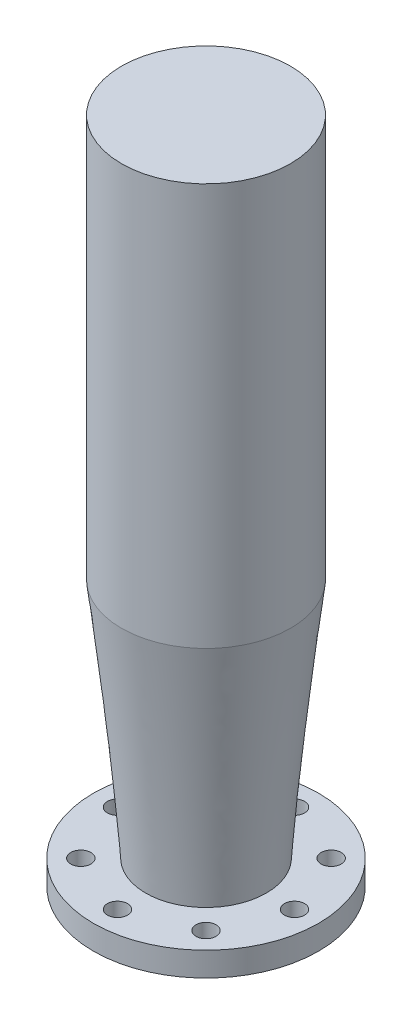
ISO-10303-21;
HEADER;
FILE_DESCRIPTION(('STEP AP214'),'2;1');
FILE_NAME('part.step','',(''),(''),'','','');
FILE_SCHEMA(('AUTOMOTIVE_DESIGN { 1 0 10303 214 1 1 1 1 }'));
ENDSEC;
DATA;
#1=APPLICATION_CONTEXT('core data for automotive mechanical design processes');
#2=APPLICATION_PROTOCOL_DEFINITION('international standard','automotive_design',2000,#1);
#3=PRODUCT_CONTEXT('',#1,'mechanical');
#4=PRODUCT('Part','Part','',(#3));
#5=PRODUCT_RELATED_PRODUCT_CATEGORY('part','',(#4));
#6=PRODUCT_DEFINITION_FORMATION('','',#4);
#7=PRODUCT_DEFINITION_CONTEXT('part definition',#1,'design');
#8=PRODUCT_DEFINITION('design','',#6,#7);
#9=PRODUCT_DEFINITION_SHAPE('','',#8);
#10=(LENGTH_UNIT() NAMED_UNIT(*) SI_UNIT(.MILLI.,.METRE.));
#11=(NAMED_UNIT(*) PLANE_ANGLE_UNIT() SI_UNIT($,.RADIAN.));
#12=(NAMED_UNIT(*) SI_UNIT($,.STERADIAN.) SOLID_ANGLE_UNIT());
#13=UNCERTAINTY_MEASURE_WITH_UNIT(LENGTH_MEASURE(1.E-05),#10,'distance_accuracy_value','');
#14=(GEOMETRIC_REPRESENTATION_CONTEXT(3) GLOBAL_UNCERTAINTY_ASSIGNED_CONTEXT((#13)) GLOBAL_UNIT_ASSIGNED_CONTEXT((#10,
#11,#12)) REPRESENTATION_CONTEXT('',''));
#15=CARTESIAN_POINT('',(0.,0.,0.));
#16=DIRECTION('',(0.,0.,1.));
#17=DIRECTION('',(1.,0.,0.));
#18=AXIS2_PLACEMENT_3D('',#15,#16,#17);
#19=CARTESIAN_POINT('',(0.,3.,0.));
#20=DIRECTION('',(0.,1.,0.));
#21=DIRECTION('',(0.,0.,1.));
#22=AXIS2_PLACEMENT_3D('',#19,#20,#21);
#23=PLANE('',#22);
#24=CARTESIAN_POINT('',(-7.77817459305222,3.,-7.77817459305155));
#25=DIRECTION('',(0.,1.,0.));
#26=DIRECTION('',(0.,0.,1.));
#27=AXIS2_PLACEMENT_3D('',#24,#25,#26);
#28=CIRCLE('',#27,1.25000000000064);
#29=CARTESIAN_POINT('',(-7.77817459305222,3.,-6.52817459305091));
#30=VERTEX_POINT('',#29);
#31=EDGE_CURVE('E103',#30,#30,#28,.T.);
#32=ORIENTED_EDGE('',*,*,#31,.F.);
#33=EDGE_LOOP('',(#32));
#34=FACE_BOUND('',#33,.T.);
#35=CARTESIAN_POINT('',(-7.77817459305155,3.,7.77817459305316));
#36=DIRECTION('',(0.,1.,0.));
#37=DIRECTION('',(0.,0.,1.));
#38=AXIS2_PLACEMENT_3D('',#35,#36,#37);
#39=CIRCLE('',#38,1.25000000000104);
#40=CARTESIAN_POINT('',(-7.77817459305155,3.,9.0281745930542));
#41=VERTEX_POINT('',#40);
#42=EDGE_CURVE('E116',#41,#41,#39,.T.);
#43=ORIENTED_EDGE('',*,*,#42,.F.);
#44=EDGE_LOOP('',(#43));
#45=FACE_BOUND('',#44,.T.);
#46=CARTESIAN_POINT('',(7.77817459305316,3.,7.77817459305249));
#47=DIRECTION('',(0.,1.,0.));
#48=DIRECTION('',(0.,0.,1.));
#49=AXIS2_PLACEMENT_3D('',#46,#47,#48);
#50=CIRCLE('',#49,1.25000000000017);
#51=CARTESIAN_POINT('',(7.77817459305316,3.,9.02817459305266));
#52=VERTEX_POINT('',#51);
#53=EDGE_CURVE('E128',#52,#52,#50,.T.);
#54=ORIENTED_EDGE('',*,*,#53,.F.);
#55=EDGE_LOOP('',(#54));
#56=FACE_BOUND('',#55,.T.);
#57=CARTESIAN_POINT('',(7.77817459305249,3.,-7.77817459305222));
#58=DIRECTION('',(0.,1.,0.));
#59=DIRECTION('',(0.,0.,1.));
#60=AXIS2_PLACEMENT_3D('',#57,#58,#59);
#61=CIRCLE('',#60,1.2499999999997);
#62=CARTESIAN_POINT('',(7.77817459305249,3.,-6.52817459305252));
#63=VERTEX_POINT('',#62);
#64=EDGE_CURVE('E140',#63,#63,#61,.T.);
#65=ORIENTED_EDGE('',*,*,#64,.F.);
#66=EDGE_LOOP('',(#65));
#67=FACE_BOUND('',#66,.T.);
#68=CARTESIAN_POINT('',(0.,3.,0.));
#69=DIRECTION('',(0.,1.,0.));
#70=DIRECTION('',(0.,0.,1.));
#71=AXIS2_PLACEMENT_3D('',#68,#69,#70);
#72=CIRCLE('',#71,14.);
#73=CARTESIAN_POINT('',(0.,3.,14.));
#74=VERTEX_POINT('',#73);
#75=EDGE_CURVE('E11',#74,#74,#72,.T.);
#76=ORIENTED_EDGE('',*,*,#75,.T.);
#77=EDGE_LOOP('',(#76));
#78=FACE_BOUND('',#77,.T.);
#79=CARTESIAN_POINT('',(0.,3.,-11.));
#80=DIRECTION('',(0.,1.,0.));
#81=DIRECTION('',(0.,0.,1.));
#82=AXIS2_PLACEMENT_3D('',#79,#80,#81);
#83=CIRCLE('',#82,1.25);
#84=CARTESIAN_POINT('',(0.,3.,-9.75));
#85=VERTEX_POINT('',#84);
#86=EDGE_CURVE('E49',#85,#85,#83,.T.);
#87=ORIENTED_EDGE('',*,*,#86,.F.);
#88=EDGE_LOOP('',(#87));
#89=FACE_BOUND('',#88,.T.);
#90=CARTESIAN_POINT('',(11.0000000000009,3.,0.));
#91=DIRECTION('',(0.,1.,0.));
#92=DIRECTION('',(0.,0.,1.));
#93=AXIS2_PLACEMENT_3D('',#90,#91,#92);
#94=CIRCLE('',#93,1.24999999999976);
#95=CARTESIAN_POINT('',(11.0000000000009,3.,1.24999999999976));
#96=VERTEX_POINT('',#95);
#97=EDGE_CURVE('E134',#96,#96,#94,.T.);
#98=ORIENTED_EDGE('',*,*,#97,.F.);
#99=EDGE_LOOP('',(#98));
#100=FACE_BOUND('',#99,.T.);
#101=CARTESIAN_POINT('',(9.40484768009522E-13,3.,11.0000000000009));
#102=DIRECTION('',(0.,1.,0.));
#103=DIRECTION('',(0.,0.,1.));
#104=AXIS2_PLACEMENT_3D('',#101,#102,#103);
#105=CIRCLE('',#104,1.2500000000007);
#106=CARTESIAN_POINT('',(9.40484768009522E-13,3.,12.2500000000016));
#107=VERTEX_POINT('',#106);
#108=EDGE_CURVE('E122',#107,#107,#105,.T.);
#109=ORIENTED_EDGE('',*,*,#108,.F.);
#110=EDGE_LOOP('',(#109));
#111=FACE_BOUND('',#110,.T.);
#112=CARTESIAN_POINT('',(-11.,3.,9.39964833997561E-13));
#113=DIRECTION('',(0.,1.,0.));
#114=DIRECTION('',(0.,0.,1.));
#115=AXIS2_PLACEMENT_3D('',#112,#113,#114);
#116=CIRCLE('',#115,1.25000000000101);
#117=CARTESIAN_POINT('',(-11.,3.,1.25000000000195));
#118=VERTEX_POINT('',#117);
#119=EDGE_CURVE('E110',#118,#118,#116,.T.);
#120=ORIENTED_EDGE('',*,*,#119,.F.);
#121=EDGE_LOOP('',(#120));
#122=FACE_BOUND('',#121,.T.);
#123=CARTESIAN_POINT('',(0.,3.,0.));
#124=DIRECTION('',(0.,1.,0.));
#125=DIRECTION('',(0.,0.,1.));
#126=AXIS2_PLACEMENT_3D('',#123,#124,#125);
#127=CIRCLE('',#126,7.5);
#128=CARTESIAN_POINT('',(-7.15586237167852,3.,2.24580357947785));
#129=VERTEX_POINT('',#128);
#130=EDGE_CURVE('E93',#129,#129,#127,.T.);
#131=ORIENTED_EDGE('',*,*,#130,.F.);
#132=EDGE_LOOP('',(#131));
#133=FACE_BOUND('',#132,.T.);
#134=ADVANCED_FACE('F35',(#34,#45,#56,#67,#78,#89,#100,#111,#122,#133),#23,.T.);
#135=CARTESIAN_POINT('',(0.,0.,0.));
#136=DIRECTION('',(0.,1.,0.));
#137=DIRECTION('',(0.,0.,1.));
#138=AXIS2_PLACEMENT_3D('',#135,#136,#137);
#139=PLANE('',#138);
#140=CARTESIAN_POINT('',(0.,0.,0.));
#141=DIRECTION('',(0.,1.,0.));
#142=DIRECTION('',(0.,0.,1.));
#143=AXIS2_PLACEMENT_3D('',#140,#141,#142);
#144=CIRCLE('',#143,14.);
#145=CARTESIAN_POINT('',(0.,0.,14.));
#146=VERTEX_POINT('',#145);
#147=EDGE_CURVE('E44',#146,#146,#144,.T.);
#148=ORIENTED_EDGE('',*,*,#147,.F.);
#149=EDGE_LOOP('',(#148));
#150=FACE_BOUND('',#149,.T.);
#151=CARTESIAN_POINT('',(0.,0.,-11.));
#152=DIRECTION('',(0.,1.,0.));
#153=DIRECTION('',(0.,0.,1.));
#154=AXIS2_PLACEMENT_3D('',#151,#152,#153);
#155=CIRCLE('',#154,1.25);
#156=CARTESIAN_POINT('',(0.,0.,-9.75));
#157=VERTEX_POINT('',#156);
#158=EDGE_CURVE('E52',#157,#157,#155,.T.);
#159=ORIENTED_EDGE('',*,*,#158,.T.);
#160=EDGE_LOOP('',(#159));
#161=FACE_BOUND('',#160,.T.);
#162=CARTESIAN_POINT('',(7.77817459305249,0.,-7.77817459305222));
#163=DIRECTION('',(0.,1.,0.));
#164=DIRECTION('',(0.,0.,1.));
#165=AXIS2_PLACEMENT_3D('',#162,#163,#164);
#166=CIRCLE('',#165,1.2499999999997);
#167=CARTESIAN_POINT('',(7.77817459305249,0.,-6.52817459305252));
#168=VERTEX_POINT('',#167);
#169=EDGE_CURVE('E137',#168,#168,#166,.T.);
#170=ORIENTED_EDGE('',*,*,#169,.T.);
#171=EDGE_LOOP('',(#170));
#172=FACE_BOUND('',#171,.T.);
#173=CARTESIAN_POINT('',(11.0000000000009,0.,0.));
#174=DIRECTION('',(0.,1.,0.));
#175=DIRECTION('',(0.,0.,1.));
#176=AXIS2_PLACEMENT_3D('',#173,#174,#175);
#177=CIRCLE('',#176,1.24999999999976);
#178=CARTESIAN_POINT('',(11.0000000000009,0.,1.24999999999976));
#179=VERTEX_POINT('',#178);
#180=EDGE_CURVE('E131',#179,#179,#177,.T.);
#181=ORIENTED_EDGE('',*,*,#180,.T.);
#182=EDGE_LOOP('',(#181));
#183=FACE_BOUND('',#182,.T.);
#184=CARTESIAN_POINT('',(7.77817459305316,0.,7.77817459305249));
#185=DIRECTION('',(0.,1.,0.));
#186=DIRECTION('',(0.,0.,1.));
#187=AXIS2_PLACEMENT_3D('',#184,#185,#186);
#188=CIRCLE('',#187,1.25000000000017);
#189=CARTESIAN_POINT('',(7.77817459305316,0.,9.02817459305266));
#190=VERTEX_POINT('',#189);
#191=EDGE_CURVE('E125',#190,#190,#188,.T.);
#192=ORIENTED_EDGE('',*,*,#191,.T.);
#193=EDGE_LOOP('',(#192));
#194=FACE_BOUND('',#193,.T.);
#195=CARTESIAN_POINT('',(9.40484768009522E-13,0.,11.0000000000009));
#196=DIRECTION('',(0.,1.,0.));
#197=DIRECTION('',(0.,0.,1.));
#198=AXIS2_PLACEMENT_3D('',#195,#196,#197);
#199=CIRCLE('',#198,1.2500000000007);
#200=CARTESIAN_POINT('',(9.40484768009522E-13,0.,12.2500000000016));
#201=VERTEX_POINT('',#200);
#202=EDGE_CURVE('E119',#201,#201,#199,.T.);
#203=ORIENTED_EDGE('',*,*,#202,.T.);
#204=EDGE_LOOP('',(#203));
#205=FACE_BOUND('',#204,.T.);
#206=CARTESIAN_POINT('',(-7.77817459305155,0.,7.77817459305316));
#207=DIRECTION('',(0.,1.,0.));
#208=DIRECTION('',(0.,0.,1.));
#209=AXIS2_PLACEMENT_3D('',#206,#207,#208);
#210=CIRCLE('',#209,1.25000000000104);
#211=CARTESIAN_POINT('',(-7.77817459305155,0.,9.0281745930542));
#212=VERTEX_POINT('',#211);
#213=EDGE_CURVE('E113',#212,#212,#210,.T.);
#214=ORIENTED_EDGE('',*,*,#213,.T.);
#215=EDGE_LOOP('',(#214));
#216=FACE_BOUND('',#215,.T.);
#217=CARTESIAN_POINT('',(-11.,0.,9.39964833997561E-13));
#218=DIRECTION('',(0.,1.,0.));
#219=DIRECTION('',(0.,0.,1.));
#220=AXIS2_PLACEMENT_3D('',#217,#218,#219);
#221=CIRCLE('',#220,1.25000000000101);
#222=CARTESIAN_POINT('',(-11.,0.,1.25000000000195));
#223=VERTEX_POINT('',#222);
#224=EDGE_CURVE('E106',#223,#223,#221,.T.);
#225=ORIENTED_EDGE('',*,*,#224,.T.);
#226=EDGE_LOOP('',(#225));
#227=FACE_BOUND('',#226,.T.);
#228=CARTESIAN_POINT('',(-7.77817459305222,0.,-7.77817459305155));
#229=DIRECTION('',(0.,1.,0.));
#230=DIRECTION('',(0.,0.,1.));
#231=AXIS2_PLACEMENT_3D('',#228,#229,#230);
#232=CIRCLE('',#231,1.25000000000064);
#233=CARTESIAN_POINT('',(-7.77817459305222,0.,-6.52817459305091));
#234=VERTEX_POINT('',#233);
#235=EDGE_CURVE('E107',#234,#234,#232,.T.);
#236=ORIENTED_EDGE('',*,*,#235,.T.);
#237=EDGE_LOOP('',(#236));
#238=FACE_BOUND('',#237,.T.);
#239=ADVANCED_FACE('F150',(#150,#161,#172,#183,#194,#205,#216,#227,#238),#139,.F.);
#240=CARTESIAN_POINT('',(0.,3.,0.));
#241=DIRECTION('',(0.,-1.,0.));
#242=DIRECTION('',(0.,0.,-1.));
#243=AXIS2_PLACEMENT_3D('',#240,#241,#242);
#244=CYLINDRICAL_SURFACE('',#243,14.);
#245=ORIENTED_EDGE('',*,*,#75,.F.);
#246=EDGE_LOOP('',(#245));
#247=FACE_BOUND('',#246,.T.);
#248=ORIENTED_EDGE('',*,*,#147,.T.);
#249=EDGE_LOOP('',(#248));
#250=FACE_BOUND('',#249,.T.);
#251=ADVANCED_FACE('F37',(#247,#250),#244,.T.);
#252=CARTESIAN_POINT('',(0.,3.,-11.));
#253=DIRECTION('',(0.,-1.,0.));
#254=DIRECTION('',(0.,0.,-1.));
#255=AXIS2_PLACEMENT_3D('',#252,#253,#254);
#256=CYLINDRICAL_SURFACE('',#255,1.25);
#257=ORIENTED_EDGE('',*,*,#86,.T.);
#258=EDGE_LOOP('',(#257));
#259=FACE_BOUND('',#258,.T.);
#260=ORIENTED_EDGE('',*,*,#158,.F.);
#261=EDGE_LOOP('',(#260));
#262=FACE_BOUND('',#261,.T.);
#263=ADVANCED_FACE('F153',(#259,#262),#256,.F.);
#264=CARTESIAN_POINT('',(7.77817459305249,3.,-7.77817459305222));
#265=DIRECTION('',(0.,-1.,0.));
#266=DIRECTION('',(0.,0.,-1.));
#267=AXIS2_PLACEMENT_3D('',#264,#265,#266);
#268=CYLINDRICAL_SURFACE('',#267,1.2499999999997);
#269=ORIENTED_EDGE('',*,*,#64,.T.);
#270=EDGE_LOOP('',(#269));
#271=FACE_BOUND('',#270,.T.);
#272=ORIENTED_EDGE('',*,*,#169,.F.);
#273=EDGE_LOOP('',(#272));
#274=FACE_BOUND('',#273,.T.);
#275=ADVANCED_FACE('F155',(#271,#274),#268,.F.);
#276=CARTESIAN_POINT('',(11.0000000000009,3.,0.));
#277=DIRECTION('',(0.,-1.,0.));
#278=DIRECTION('',(0.,0.,-1.));
#279=AXIS2_PLACEMENT_3D('',#276,#277,#278);
#280=CYLINDRICAL_SURFACE('',#279,1.24999999999976);
#281=ORIENTED_EDGE('',*,*,#97,.T.);
#282=EDGE_LOOP('',(#281));
#283=FACE_BOUND('',#282,.T.);
#284=ORIENTED_EDGE('',*,*,#180,.F.);
#285=EDGE_LOOP('',(#284));
#286=FACE_BOUND('',#285,.T.);
#287=ADVANCED_FACE('F161',(#283,#286),#280,.F.);
#288=CARTESIAN_POINT('',(7.77817459305316,3.,7.77817459305249));
#289=DIRECTION('',(0.,-1.,0.));
#290=DIRECTION('',(0.,0.,-1.));
#291=AXIS2_PLACEMENT_3D('',#288,#289,#290);
#292=CYLINDRICAL_SURFACE('',#291,1.25000000000017);
#293=ORIENTED_EDGE('',*,*,#53,.T.);
#294=EDGE_LOOP('',(#293));
#295=FACE_BOUND('',#294,.T.);
#296=ORIENTED_EDGE('',*,*,#191,.F.);
#297=EDGE_LOOP('',(#296));
#298=FACE_BOUND('',#297,.T.);
#299=ADVANCED_FACE('F252',(#295,#298),#292,.F.);
#300=CARTESIAN_POINT('',(9.40484768009522E-13,3.,11.0000000000009));
#301=DIRECTION('',(0.,-1.,0.));
#302=DIRECTION('',(0.,0.,-1.));
#303=AXIS2_PLACEMENT_3D('',#300,#301,#302);
#304=CYLINDRICAL_SURFACE('',#303,1.2500000000007);
#305=ORIENTED_EDGE('',*,*,#108,.T.);
#306=EDGE_LOOP('',(#305));
#307=FACE_BOUND('',#306,.T.);
#308=ORIENTED_EDGE('',*,*,#202,.F.);
#309=EDGE_LOOP('',(#308));
#310=FACE_BOUND('',#309,.T.);
#311=ADVANCED_FACE('F243',(#307,#310),#304,.F.);
#312=CARTESIAN_POINT('',(-7.77817459305155,3.,7.77817459305316));
#313=DIRECTION('',(0.,-1.,0.));
#314=DIRECTION('',(0.,0.,-1.));
#315=AXIS2_PLACEMENT_3D('',#312,#313,#314);
#316=CYLINDRICAL_SURFACE('',#315,1.25000000000104);
#317=ORIENTED_EDGE('',*,*,#42,.T.);
#318=EDGE_LOOP('',(#317));
#319=FACE_BOUND('',#318,.T.);
#320=ORIENTED_EDGE('',*,*,#213,.F.);
#321=EDGE_LOOP('',(#320));
#322=FACE_BOUND('',#321,.T.);
#323=ADVANCED_FACE('F193',(#319,#322),#316,.F.);
#324=CARTESIAN_POINT('',(-11.,3.,9.39964833997561E-13));
#325=DIRECTION('',(0.,-1.,0.));
#326=DIRECTION('',(0.,0.,-1.));
#327=AXIS2_PLACEMENT_3D('',#324,#325,#326);
#328=CYLINDRICAL_SURFACE('',#327,1.25000000000101);
#329=ORIENTED_EDGE('',*,*,#119,.T.);
#330=EDGE_LOOP('',(#329));
#331=FACE_BOUND('',#330,.T.);
#332=ORIENTED_EDGE('',*,*,#224,.F.);
#333=EDGE_LOOP('',(#332));
#334=FACE_BOUND('',#333,.T.);
#335=ADVANCED_FACE('F190',(#331,#334),#328,.F.);
#336=CARTESIAN_POINT('',(-7.77817459305222,3.,-7.77817459305155));
#337=DIRECTION('',(0.,-1.,0.));
#338=DIRECTION('',(0.,0.,-1.));
#339=AXIS2_PLACEMENT_3D('',#336,#337,#338);
#340=CYLINDRICAL_SURFACE('',#339,1.25000000000064);
#341=ORIENTED_EDGE('',*,*,#31,.T.);
#342=EDGE_LOOP('',(#341));
#343=FACE_BOUND('',#342,.T.);
#344=ORIENTED_EDGE('',*,*,#235,.F.);
#345=EDGE_LOOP('',(#344));
#346=FACE_BOUND('',#345,.T.);
#347=ADVANCED_FACE('F79',(#343,#346),#340,.F.);
#348=CARTESIAN_POINT('',(-7.15586237167852,3.,2.24580357947785));
#349=CARTESIAN_POINT('',(-10.4306665700331,33.,-1.20465551291422));
#350=CARTESIAN_POINT('',(-2.66425521272281,3.,16.5575283228349));
#351=CARTESIAN_POINT('',(-12.8399775958615,33.,19.6566776271519));
#352=CARTESIAN_POINT('',(11.6474695306342,3.,12.0659211638792));
#353=CARTESIAN_POINT('',(8.02135554420462,33.,22.0659886529804));
#354=CARTESIAN_POINT('',(7.15586237167851,3.,-2.24580357947785));
#355=CARTESIAN_POINT('',(10.4306665700331,33.,1.20465551291422));
#356=CARTESIAN_POINT('',(2.66425521272281,3.,-16.5575283228349));
#357=CARTESIAN_POINT('',(12.8399775958615,33.,-19.6566776271519));
#358=CARTESIAN_POINT('',(-11.6474695306342,3.,-12.0659211638792));
#359=CARTESIAN_POINT('',(-8.02135554420462,33.,-22.0659886529804));
#360=CARTESIAN_POINT('',(-7.15586237167852,3.,2.24580357947785));
#361=CARTESIAN_POINT('',(-10.4306665700331,33.,-1.20465551291422));
#362=(BOUNDED_SURFACE() B_SPLINE_SURFACE(3,1,((#348,#349),(#350,#351),(#352,#353),(#354,#355),
(#356,#357),(#358,#359),(#360,#361)),.UNSPECIFIED.,.T.,.F.,.F.) B_SPLINE_SURFACE_WITH_KNOTS((4,
3,4),(2,2),(0.,0.5,1.),(0.,1.),
.UNSPECIFIED.) GEOMETRIC_REPRESENTATION_ITEM() RATIONAL_B_SPLINE_SURFACE(((1.,1.),
(0.333333333333333,0.333333333333333),(0.333333333333333,0.333333333333333),(1.,1.),
(0.333333333333333,0.333333333333333),(0.333333333333333,0.333333333333333),(1.,1.))) REPRESENTATION_ITEM('') SURFACE());
#363=CARTESIAN_POINT('',(0.,33.,0.));
#364=DIRECTION('',(0.,1.,0.));
#365=DIRECTION('',(0.,0.,1.));
#366=AXIS2_PLACEMENT_3D('',#363,#364,#365);
#367=CIRCLE('',#366,10.5);
#368=CARTESIAN_POINT('',(-10.4306665700331,33.,-1.20465551291422));
#369=VERTEX_POINT('',#368);
#370=EDGE_CURVE('E39',#369,#369,#367,.T.);
#371=CARTESIAN_POINT('',(-7.15586237167852,3.,2.24580357947785));
#372=CARTESIAN_POINT('',(-7.18997491541138,3.3125,2.20986129726544));
#373=CARTESIAN_POINT('',(-7.22408745914424,3.625,2.17391901505302));
#374=CARTESIAN_POINT('',(-7.29231254660995,4.25,2.10203445062818));
#375=CARTESIAN_POINT('',(-7.32642509034281,4.5625,2.06609216841577));
#376=CARTESIAN_POINT('',(-7.39465017780853,5.1875,1.99420760399093));
#377=CARTESIAN_POINT('',(-7.42876272154139,5.5,1.95826532177851));
#378=CARTESIAN_POINT('',(-7.49698780900711,6.125,1.88638075735368));
#379=CARTESIAN_POINT('',(-7.53110035273997,6.4375,1.85043847514126));
#380=CARTESIAN_POINT('',(-7.59932544020569,7.0625,1.77855391071643));
#381=CARTESIAN_POINT('',(-7.63343798393855,7.375,1.74261162850401));
#382=CARTESIAN_POINT('',(-7.70166307140427,8.,1.67072706407917));
#383=CARTESIAN_POINT('',(-7.73577561513713,8.3125,1.63478478186676));
#384=CARTESIAN_POINT('',(-7.80400070260285,8.9375,1.56290021744192));
#385=CARTESIAN_POINT('',(-7.83811324633571,9.25,1.5269579352295));
#386=CARTESIAN_POINT('',(-7.90633833380143,9.875,1.45507337080467));
#387=CARTESIAN_POINT('',(-7.94045087753429,10.1875,1.41913108859225));
#388=CARTESIAN_POINT('',(-8.00867596500001,10.8125,1.34724652416742));
#389=CARTESIAN_POINT('',(-8.04278850873287,11.125,1.311304241955));
#390=CARTESIAN_POINT('',(-8.11101359619859,11.75,1.23941967753016));
#391=CARTESIAN_POINT('',(-8.14512613993145,12.0625,1.20347739531775));
#392=CARTESIAN_POINT('',(-8.21335122739717,12.6875,1.13159283089291));
#393=CARTESIAN_POINT('',(-8.24746377113003,13.,1.09565054868049));
#394=CARTESIAN_POINT('',(-8.31568885859575,13.625,1.02376598425566));
#395=CARTESIAN_POINT('',(-8.34980140232861,13.9375,0.987823702043242));
#396=CARTESIAN_POINT('',(-8.41802648979433,14.5625,0.915939137618407));
#397=CARTESIAN_POINT('',(-8.45213903352719,14.875,0.87999685540599));
#398=CARTESIAN_POINT('',(-8.52036412099291,15.5,0.808112290981155));
#399=CARTESIAN_POINT('',(-8.55447666472577,15.8125,0.772170008768737));
#400=CARTESIAN_POINT('',(-8.62270175219149,16.4375,0.700285444343902));
#401=CARTESIAN_POINT('',(-8.65681429592435,16.75,0.664343162131485));
#402=CARTESIAN_POINT('',(-8.72503938339007,17.375,0.59245859770665));
#403=CARTESIAN_POINT('',(-8.75915192712293,17.6875,0.556516315494233));
#404=CARTESIAN_POINT('',(-8.82737701458865,18.3125,0.484631751069398));
#405=CARTESIAN_POINT('',(-8.86148955832151,18.625,0.44868946885698));
#406=CARTESIAN_POINT('',(-8.92971464578723,19.25,0.376804904432145));
#407=CARTESIAN_POINT('',(-8.96382718952009,19.5625,0.340862622219728));
#408=CARTESIAN_POINT('',(-9.03205227698581,20.1875,0.268978057794893));
#409=CARTESIAN_POINT('',(-9.06616482071867,20.5,0.233035775582475));
#410=CARTESIAN_POINT('',(-9.13438990818439,21.125,0.16115121115764));
#411=CARTESIAN_POINT('',(-9.16850245191725,21.4375,0.125208928945223));
#412=CARTESIAN_POINT('',(-9.23672753938297,22.0625,0.0533243645203882));
#413=CARTESIAN_POINT('',(-9.27084008311583,22.375,0.0173820823079709));
#414=CARTESIAN_POINT('',(-9.33906517058155,23.,-0.0545024821168641));
#415=CARTESIAN_POINT('',(-9.37317771431441,23.3125,-0.0904447643292817));
#416=CARTESIAN_POINT('',(-9.44140280178013,23.9375,-0.162329328754117));
#417=CARTESIAN_POINT('',(-9.47551534551299,24.25,-0.198271610966534));
#418=CARTESIAN_POINT('',(-9.54374043297871,24.875,-0.270156175391369));
#419=CARTESIAN_POINT('',(-9.57785297671157,25.1875,-0.306098457603786));
#420=CARTESIAN_POINT('',(-9.64607806417729,25.8125,-0.377983022028621));
#421=CARTESIAN_POINT('',(-9.68019060791015,26.125,-0.413925304241039));
#422=CARTESIAN_POINT('',(-9.74841569537587,26.75,-0.485809868665874));
#423=CARTESIAN_POINT('',(-9.78252823910873,27.0625,-0.521752150878291));
#424=CARTESIAN_POINT('',(-9.85075332657445,27.6875,-0.593636715303126));
#425=CARTESIAN_POINT('',(-9.88486587030731,28.,-0.629578997515544));
#426=CARTESIAN_POINT('',(-9.95309095777303,28.625,-0.701463561940379));
#427=CARTESIAN_POINT('',(-9.98720350150589,28.9375,-0.737405844152796));
#428=CARTESIAN_POINT('',(-10.0554285889716,29.5625,-0.809290408577631));
#429=CARTESIAN_POINT('',(-10.0895411327045,29.875,-0.845232690790048));
#430=CARTESIAN_POINT('',(-10.1577662201702,30.5,-0.917117255214883));
#431=CARTESIAN_POINT('',(-10.191878763903,30.8125,-0.953059537427301));
#432=CARTESIAN_POINT('',(-10.2601038513688,31.4375,-1.02494410185214));
#433=CARTESIAN_POINT('',(-10.2942163951016,31.75,-1.06088638406455));
#434=CARTESIAN_POINT('',(-10.3624414825673,32.375,-1.13277094848939));
#435=CARTESIAN_POINT('',(-10.3965540263002,32.6875,-1.16871323070181));
#436=CARTESIAN_POINT('',(-10.4306665700331,33.,-1.20465551291422));
#437=B_SPLINE_CURVE_WITH_KNOTS('',3,(#371,#372,#373,#374,#375,#376,#377,#378,#379,#380,#381,
#382,#383,#384,#385,#386,#387,#388,#389,#390,#391,#392,#393,#394,#395,#396,#397,#398,#399,#400,
#401,#402,#403,#404,#405,#406,#407,#408,#409,#410,#411,#412,#413,#414,#415,#416,#417,#418,#419,
#420,#421,#422,#423,#424,#425,#426,#427,#428,#429,#430,#431,#432,#433,#434,#435,#436),
.UNSPECIFIED.,.F.,.F.,(4,2,2,2,2,2,2,2,2,2,2,2,2,2,2,2,2,2,2,2,2,2,2,2,2,2,2,2,2,2,2,2,4),(0.,
0.949213289843263,1.89842657968653,2.84763986952979,3.79685315937305,4.74606644921631,
5.69527973905958,6.64449302890284,7.5937063187461,8.54291960858937,9.49213289843263,
10.4413461882759,11.3905594781192,12.3397727679624,13.2889860578057,14.2381993476489,
15.1874126374922,16.1366259273355,17.0858392171787,18.035052507022,18.9842657968653,
19.9334790867085,20.8826923765518,21.831905666395,22.7811189562383,23.7303322460816,
24.6795455359248,25.6287588257681,26.5779721156114,27.5271854054546,28.4763986952979,
29.4256119851412,30.3748252749844),.UNSPECIFIED.);
#438=EDGE_CURVE('BSEAM72',#129,#369,#437,.T.);
#439=ORIENTED_EDGE('',*,*,#130,.T.);
#440=ORIENTED_EDGE('',*,*,#370,.F.);
#441=ORIENTED_EDGE('',*,*,#438,.T.);
#442=ORIENTED_EDGE('',*,*,#438,.F.);
#443=EDGE_LOOP('',(#439,#441,#440,#442));
#444=FACE_BOUND('',#443,.T.);
#445=ADVANCED_FACE('F72',(#444),#362,.T.);
#446=CARTESIAN_POINT('',(0.,83.,0.));
#447=DIRECTION('',(0.,-1.,0.));
#448=DIRECTION('',(0.,0.,-1.));
#449=AXIS2_PLACEMENT_3D('',#446,#447,#448);
#450=CYLINDRICAL_SURFACE('',#449,10.5);
#451=CARTESIAN_POINT('',(0.,83.,0.));
#452=DIRECTION('',(0.,1.,0.));
#453=DIRECTION('',(0.,0.,1.));
#454=AXIS2_PLACEMENT_3D('',#451,#452,#453);
#455=CIRCLE('',#454,10.5);
#456=CARTESIAN_POINT('',(0.,83.,10.5));
#457=VERTEX_POINT('',#456);
#458=EDGE_CURVE('E100',#457,#457,#455,.T.);
#459=ORIENTED_EDGE('',*,*,#458,.F.);
#460=EDGE_LOOP('',(#459));
#461=FACE_BOUND('',#460,.T.);
#462=ORIENTED_EDGE('',*,*,#370,.T.);
#463=EDGE_LOOP('',(#462));
#464=FACE_BOUND('',#463,.T.);
#465=ADVANCED_FACE('F61',(#461,#464),#450,.T.);
#466=CARTESIAN_POINT('',(0.,83.,0.));
#467=DIRECTION('',(0.,1.,0.));
#468=DIRECTION('',(0.,0.,1.));
#469=AXIS2_PLACEMENT_3D('',#466,#467,#468);
#470=PLANE('',#469);
#471=ORIENTED_EDGE('',*,*,#458,.T.);
#472=EDGE_LOOP('',(#471));
#473=FACE_BOUND('',#472,.T.);
#474=ADVANCED_FACE('F71',(#473),#470,.T.);
#475=CLOSED_SHELL('',(#134,#239,#251,#263,#275,#287,#299,#311,#323,#335,#347,#445,#465,#474));
#476=MANIFOLD_SOLID_BREP('B2',#475);
#477=ADVANCED_BREP_SHAPE_REPRESENTATION('',(#18,#476),#14);
#478=SHAPE_DEFINITION_REPRESENTATION(#9,#477);
ENDSEC;
END-ISO-10303-21;
